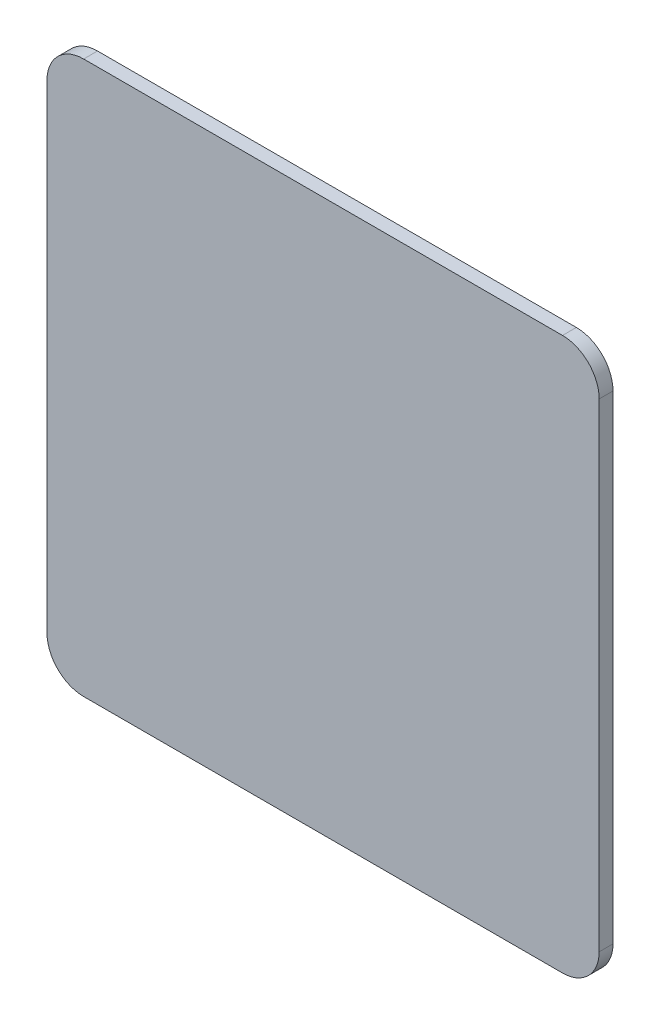
ISO-10303-21;
HEADER;
FILE_DESCRIPTION(('STEP AP214'),'2;1');
FILE_NAME('part.step','',(''),(''),'','','');
FILE_SCHEMA(('AUTOMOTIVE_DESIGN { 1 0 10303 214 1 1 1 1 }'));
ENDSEC;
DATA;
#1=APPLICATION_CONTEXT('core data for automotive mechanical design processes');
#2=APPLICATION_PROTOCOL_DEFINITION('international standard','automotive_design',2000,#1);
#3=PRODUCT_CONTEXT('',#1,'mechanical');
#4=PRODUCT('Part','Part','',(#3));
#5=PRODUCT_RELATED_PRODUCT_CATEGORY('part','',(#4));
#6=PRODUCT_DEFINITION_FORMATION('','',#4);
#7=PRODUCT_DEFINITION_CONTEXT('part definition',#1,'design');
#8=PRODUCT_DEFINITION('design','',#6,#7);
#9=PRODUCT_DEFINITION_SHAPE('','',#8);
#10=(LENGTH_UNIT() NAMED_UNIT(*) SI_UNIT(.MILLI.,.METRE.));
#11=(NAMED_UNIT(*) PLANE_ANGLE_UNIT() SI_UNIT($,.RADIAN.));
#12=(NAMED_UNIT(*) SI_UNIT($,.STERADIAN.) SOLID_ANGLE_UNIT());
#13=UNCERTAINTY_MEASURE_WITH_UNIT(LENGTH_MEASURE(1.E-05),#10,'distance_accuracy_value','');
#14=(GEOMETRIC_REPRESENTATION_CONTEXT(3) GLOBAL_UNCERTAINTY_ASSIGNED_CONTEXT((#13)) GLOBAL_UNIT_ASSIGNED_CONTEXT((#10,
#11,#12)) REPRESENTATION_CONTEXT('',''));
#15=CARTESIAN_POINT('',(0.,0.,0.));
#16=DIRECTION('',(0.,0.,1.));
#17=DIRECTION('',(1.,0.,0.));
#18=AXIS2_PLACEMENT_3D('',#15,#16,#17);
#19=CARTESIAN_POINT('',(14.24999934,-5.000000563835,-2.711602067947));
#20=DIRECTION('',(0.,8.74227761983997E-08,-0.999999999999996));
#21=DIRECTION('',(0.,0.999999999999996,8.74227761983997E-08));
#22=AXIS2_PLACEMENT_3D('',#19,#20,#21);
#23=PLANE('',#22);
#24=CARTESIAN_POINT('',(12.519999264379,-6.730000488214,-2.71160221918896));
#25=DIRECTION('',(0.,8.74227761983997E-08,-0.999999999999996));
#26=DIRECTION('',(0.,0.999999999999996,8.74227761983997E-08));
#27=AXIS2_PLACEMENT_3D('',#24,#25,#26);
#28=CIRCLE('',#27,0.265);
#29=CARTESIAN_POINT('',(12.5199992527957,-6.9950004882143,-2.711602242356));
#30=VERTEX_POINT('',#29);
#31=CARTESIAN_POINT('',(12.254999264379,-6.73000047663074,-2.71160221918898));
#32=VERTEX_POINT('',#31);
#33=EDGE_CURVE('E20',#30,#32,#28,.T.);
#34=ORIENTED_EDGE('',*,*,#33,.F.);
#35=DIRECTION('',(0.999999999999999,-4.37113883669596E-08,0.));
#36=VECTOR('',#35,1.);
#37=CARTESIAN_POINT('',(15.979999252796,-6.995000639456,-2.711602242356));
#38=LINE('',#37,#36);
#39=CARTESIAN_POINT('',(15.9799992527957,-6.995000639456,-2.71160224235602));
#40=VERTEX_POINT('',#39);
#41=EDGE_CURVE('E99',#40,#30,#38,.F.);
#42=ORIENTED_EDGE('',*,*,#41,.F.);
#43=CARTESIAN_POINT('',(15.979999264379,-6.730000639456,-2.711602219189));
#44=DIRECTION('',(0.,8.74227761983997E-08,-0.999999999999996));
#45=DIRECTION('',(0.,0.999999999999996,8.74227761983997E-08));
#46=AXIS2_PLACEMENT_3D('',#43,#44,#45);
#47=CIRCLE('',#46,0.265);
#48=CARTESIAN_POINT('',(16.2449992643794,-6.73000065103941,-2.7116020679475));
#49=VERTEX_POINT('',#48);
#50=EDGE_CURVE('E107',#49,#40,#47,.T.);
#51=ORIENTED_EDGE('',*,*,#50,.F.);
#52=DIRECTION('',(4.371138828674E-08,0.999999999999999,0.));
#53=VECTOR('',#52,1.);
#54=CARTESIAN_POINT('',(16.244999415621,-3.270000651039,-2.711601916706));
#55=LINE('',#54,#53);
#56=CARTESIAN_POINT('',(16.244999415621,-3.270000642297,-2.71160191670602));
#57=VERTEX_POINT('',#56);
#58=EDGE_CURVE('E111',#57,#49,#55,.F.);
#59=ORIENTED_EDGE('',*,*,#58,.F.);
#60=CARTESIAN_POINT('',(15.979999415621,-3.270000639456,-2.71160191670604));
#61=DIRECTION('',(0.,8.74227761983997E-08,-0.999999999999996));
#62=DIRECTION('',(0.,0.999999999999996,8.74227761983997E-08));
#63=AXIS2_PLACEMENT_3D('',#60,#61,#62);
#64=CIRCLE('',#63,0.265);
#65=CARTESIAN_POINT('',(15.9799994214128,-3.0050006394557,-2.711601893539));
#66=VERTEX_POINT('',#65);
#67=EDGE_CURVE('E115',#66,#57,#64,.T.);
#68=ORIENTED_EDGE('',*,*,#67,.F.);
#69=DIRECTION('',(0.999999999999999,-4.37113882867396E-08,0.));
#70=VECTOR('',#69,1.);
#71=CARTESIAN_POINT('',(12.519999427204,-3.005000488214,-2.711601893539));
#72=LINE('',#71,#70);
#73=CARTESIAN_POINT('',(12.5199994272043,-3.005000488214,-2.71160189353898));
#74=VERTEX_POINT('',#73);
#75=EDGE_CURVE('E119',#74,#66,#72,.T.);
#76=ORIENTED_EDGE('',*,*,#75,.F.);
#77=CARTESIAN_POINT('',(12.519999415621,-3.270000488214,-2.711601916706));
#78=DIRECTION('',(0.,8.74227761983997E-08,-0.999999999999996));
#79=DIRECTION('',(0.,0.999999999999996,8.74227761983997E-08));
#80=AXIS2_PLACEMENT_3D('',#77,#78,#79);
#81=CIRCLE('',#80,0.265);
#82=CARTESIAN_POINT('',(12.2549994156206,-3.27000047663037,-2.7116020679475));
#83=VERTEX_POINT('',#82);
#84=EDGE_CURVE('E88',#83,#74,#81,.T.);
#85=ORIENTED_EDGE('',*,*,#84,.F.);
#86=DIRECTION('',(-4.371138828674E-08,-0.999999999999999,0.));
#87=VECTOR('',#86,1.);
#88=CARTESIAN_POINT('',(12.254999264379,-6.730000476631,-2.711602219189));
#89=LINE('',#88,#87);
#90=EDGE_CURVE('E85',#32,#83,#89,.F.);
#91=ORIENTED_EDGE('',*,*,#90,.F.);
#92=EDGE_LOOP('',(#34,#42,#51,#59,#68,#76,#85,#91));
#93=FACE_BOUND('',#92,.T.);
#94=ADVANCED_FACE('F17',(#93),#23,.F.);
#95=CARTESIAN_POINT('',(12.254999264379,-6.730000476631,-2.711602219189));
#96=DIRECTION('',(-0.999999999999999,4.371138828674E-08,0.));
#97=DIRECTION('',(-4.371138828674E-08,-0.999999999999999,0.));
#98=AXIS2_PLACEMENT_3D('',#95,#96,#97);
#99=PLANE('',#98);
#100=DIRECTION('',(0.,0.999999999999996,8.74227761983997E-08));
#101=VECTOR('',#100,1.);
#102=CARTESIAN_POINT('',(12.254999264379,-5.000000555093,-2.811602067947));
#103=LINE('',#102,#101);
#104=CARTESIAN_POINT('',(12.254999264379,-6.73000047368022,-2.8116022191887));
#105=VERTEX_POINT('',#104);
#106=CARTESIAN_POINT('',(12.25499934,-3.27000047367986,-2.81160191670604));
#107=VERTEX_POINT('',#106);
#108=EDGE_CURVE('E94',#105,#107,#103,.T.);
#109=ORIENTED_EDGE('',*,*,#108,.F.);
#110=DIRECTION('',(0.,8.74227761983997E-08,-0.999999999999996));
#111=VECTOR('',#110,1.);
#112=CARTESIAN_POINT('',(12.254999264379,-6.730000476631,-2.711602219189));
#113=LINE('',#112,#111);
#114=EDGE_CURVE('E84',#32,#105,#113,.T.);
#115=ORIENTED_EDGE('',*,*,#114,.F.);
#116=ORIENTED_EDGE('',*,*,#90,.T.);
#117=DIRECTION('',(0.,8.74227761983997E-08,-0.999999999999996));
#118=VECTOR('',#117,1.);
#119=CARTESIAN_POINT('',(12.254999415621,-3.27000047663028,-2.711601916706));
#120=LINE('',#119,#118);
#121=EDGE_CURVE('E120',#107,#83,#120,.F.);
#122=ORIENTED_EDGE('',*,*,#121,.F.);
#123=EDGE_LOOP('',(#109,#115,#116,#122));
#124=FACE_BOUND('',#123,.T.);
#125=ADVANCED_FACE('F92',(#124),#99,.T.);
#126=CARTESIAN_POINT('',(12.519999415621,-3.270000488214,-2.711601916706));
#127=DIRECTION('',(0.,8.74227761983997E-08,-0.999999999999996));
#128=DIRECTION('',(0.,0.999999999999996,8.74227761983997E-08));
#129=AXIS2_PLACEMENT_3D('',#126,#127,#128);
#130=CYLINDRICAL_SURFACE('',#129,0.265);
#131=CARTESIAN_POINT('',(12.519999415621,-3.27000047947172,-2.81160191670604));
#132=DIRECTION('',(0.,8.74227761983997E-08,-0.999999999999996));
#133=DIRECTION('',(0.,0.999999999999996,8.74227761983997E-08));
#134=AXIS2_PLACEMENT_3D('',#131,#132,#133);
#135=CIRCLE('',#134,0.265);
#136=CARTESIAN_POINT('',(12.5199994214125,-3.00500047947193,-2.81160189353878));
#137=VERTEX_POINT('',#136);
#138=EDGE_CURVE('E135',#107,#137,#135,.T.);
#139=ORIENTED_EDGE('',*,*,#138,.F.);
#140=ORIENTED_EDGE('',*,*,#121,.T.);
#141=ORIENTED_EDGE('',*,*,#84,.T.);
#142=DIRECTION('',(0.,-8.74227761983997E-08,0.999999999999996));
#143=VECTOR('',#142,1.);
#144=CARTESIAN_POINT('',(12.519999427204,-3.005000488214,-2.711601893539));
#145=LINE('',#144,#143);
#146=EDGE_CURVE('E116',#137,#74,#145,.T.);
#147=ORIENTED_EDGE('',*,*,#146,.F.);
#148=EDGE_LOOP('',(#139,#140,#141,#147));
#149=FACE_BOUND('',#148,.T.);
#150=ADVANCED_FACE('F143',(#149),#130,.T.);
#151=CARTESIAN_POINT('',(12.519999427204,-3.005000488214,-2.711601893539));
#152=DIRECTION('',(4.37113882867398E-08,0.999999999999995,8.74227761983996E-08));
#153=DIRECTION('',(0.,-8.74227761983997E-08,0.999999999999996));
#154=AXIS2_PLACEMENT_3D('',#151,#152,#153);
#155=PLANE('',#154);
#156=DIRECTION('',(1.,0.,0.));
#157=VECTOR('',#156,1.);
#158=CARTESIAN_POINT('',(14.24999934,-3.005000479472,-2.81160189353856));
#159=LINE('',#158,#157);
#160=CARTESIAN_POINT('',(15.979999415621,-3.00500055509286,-2.81160189353896));
#161=VERTEX_POINT('',#160);
#162=EDGE_CURVE('E134',#137,#161,#159,.T.);
#163=ORIENTED_EDGE('',*,*,#162,.F.);
#164=ORIENTED_EDGE('',*,*,#146,.T.);
#165=ORIENTED_EDGE('',*,*,#75,.T.);
#166=DIRECTION('',(0.,8.74227761983997E-08,-0.999999999999996));
#167=VECTOR('',#166,1.);
#168=CARTESIAN_POINT('',(15.979999415621,-3.005000639456,-2.71160189353896));
#169=LINE('',#168,#167);
#170=EDGE_CURVE('E112',#161,#66,#169,.F.);
#171=ORIENTED_EDGE('',*,*,#170,.F.);
#172=EDGE_LOOP('',(#163,#164,#165,#171));
#173=FACE_BOUND('',#172,.T.);
#174=ADVANCED_FACE('F146',(#173),#155,.T.);
#175=CARTESIAN_POINT('',(15.979999415621,-3.270000639456,-2.711601916706));
#176=DIRECTION('',(0.,8.74227761983997E-08,-0.999999999999996));
#177=DIRECTION('',(0.,0.999999999999996,8.74227761983997E-08));
#178=AXIS2_PLACEMENT_3D('',#175,#176,#177);
#179=CYLINDRICAL_SURFACE('',#178,0.265);
#180=CARTESIAN_POINT('',(15.979999415621,-3.27000063071372,-2.811601916706));
#181=DIRECTION('',(0.,8.74227761983997E-08,-0.999999999999996));
#182=DIRECTION('',(0.,0.999999999999996,8.74227761983997E-08));
#183=AXIS2_PLACEMENT_3D('',#180,#181,#182);
#184=CIRCLE('',#183,0.265);
#185=CARTESIAN_POINT('',(16.244999415621,-3.27000063650536,-2.811601916706));
#186=VERTEX_POINT('',#185);
#187=EDGE_CURVE('E131',#161,#186,#184,.T.);
#188=ORIENTED_EDGE('',*,*,#187,.F.);
#189=ORIENTED_EDGE('',*,*,#170,.T.);
#190=ORIENTED_EDGE('',*,*,#67,.T.);
#191=DIRECTION('',(0.,0.,1.));
#192=VECTOR('',#191,1.);
#193=CARTESIAN_POINT('',(16.244999415621,-3.270000642297,-2.711601916706));
#194=LINE('',#193,#192);
#195=EDGE_CURVE('E108',#186,#57,#194,.T.);
#196=ORIENTED_EDGE('',*,*,#195,.F.);
#197=EDGE_LOOP('',(#188,#189,#190,#196));
#198=FACE_BOUND('',#197,.T.);
#199=ADVANCED_FACE('F163',(#198),#179,.T.);
#200=CARTESIAN_POINT('',(16.244999415621,-3.270000651039,-2.711601916706));
#201=DIRECTION('',(0.999999999999999,-4.371138828674E-08,0.));
#202=DIRECTION('',(4.371138828674E-08,0.999999999999999,0.));
#203=AXIS2_PLACEMENT_3D('',#200,#201,#202);
#204=PLANE('',#203);
#205=DIRECTION('',(0.,0.999999999999996,8.74227761983997E-08));
#206=VECTOR('',#205,1.);
#207=CARTESIAN_POINT('',(16.244999415621,-5.000000555093,-2.811602067947));
#208=LINE('',#207,#206);
#209=CARTESIAN_POINT('',(16.24499934,-6.73000063650536,-2.81160221918896));
#210=VERTEX_POINT('',#209);
#211=EDGE_CURVE('E130',#186,#210,#208,.F.);
#212=ORIENTED_EDGE('',*,*,#211,.F.);
#213=ORIENTED_EDGE('',*,*,#195,.T.);
#214=ORIENTED_EDGE('',*,*,#58,.T.);
#215=DIRECTION('',(0.,8.74227761983997E-08,-0.999999999999996));
#216=VECTOR('',#215,1.);
#217=CARTESIAN_POINT('',(16.244999264379,-6.73000065103928,-2.711602219189));
#218=LINE('',#217,#216);
#219=EDGE_CURVE('E104',#210,#49,#218,.F.);
#220=ORIENTED_EDGE('',*,*,#219,.F.);
#221=EDGE_LOOP('',(#212,#213,#214,#220));
#222=FACE_BOUND('',#221,.T.);
#223=ADVANCED_FACE('F158',(#222),#204,.T.);
#224=CARTESIAN_POINT('',(15.979999264379,-6.730000639456,-2.711602219189));
#225=DIRECTION('',(0.,8.74227761983997E-08,-0.999999999999996));
#226=DIRECTION('',(0.,0.999999999999996,8.74227761983997E-08));
#227=AXIS2_PLACEMENT_3D('',#224,#225,#226);
#228=CYLINDRICAL_SURFACE('',#227,0.265);
#229=CARTESIAN_POINT('',(15.979999264379,-6.73000063071372,-2.81160221918896));
#230=DIRECTION('',(0.,8.74227761983997E-08,-0.999999999999996));
#231=DIRECTION('',(0.,0.999999999999996,8.74227761983997E-08));
#232=AXIS2_PLACEMENT_3D('',#229,#230,#231);
#233=CIRCLE('',#232,0.265);
#234=CARTESIAN_POINT('',(15.9799992585875,-6.99500063071336,-2.811602242356));
#235=VERTEX_POINT('',#234);
#236=EDGE_CURVE('E127',#210,#235,#233,.T.);
#237=ORIENTED_EDGE('',*,*,#236,.F.);
#238=ORIENTED_EDGE('',*,*,#219,.T.);
#239=ORIENTED_EDGE('',*,*,#50,.T.);
#240=DIRECTION('',(0.,8.74227761983997E-08,-0.999999999999996));
#241=VECTOR('',#240,1.);
#242=CARTESIAN_POINT('',(15.979999252796,-6.995000639456,-2.711602242356));
#243=LINE('',#242,#241);
#244=EDGE_CURVE('E95',#235,#40,#243,.F.);
#245=ORIENTED_EDGE('',*,*,#244,.F.);
#246=EDGE_LOOP('',(#237,#238,#239,#245));
#247=FACE_BOUND('',#246,.T.);
#248=ADVANCED_FACE('F160',(#247),#228,.T.);
#249=CARTESIAN_POINT('',(15.979999252796,-6.995000639456,-2.711602242356));
#250=DIRECTION('',(-4.37113883669598E-08,-0.999999999999995,-8.74227761983996E-08));
#251=DIRECTION('',(0.,8.74227761983997E-08,-0.999999999999996));
#252=AXIS2_PLACEMENT_3D('',#249,#250,#251);
#253=PLANE('',#252);
#254=DIRECTION('',(1.,0.,0.));
#255=VECTOR('',#254,1.);
#256=CARTESIAN_POINT('',(14.24999934,-6.995000630713,-2.81160224235545));
#257=LINE('',#256,#255);
#258=CARTESIAN_POINT('',(12.5199992585875,-6.99500055509236,-2.81160224235604));
#259=VERTEX_POINT('',#258);
#260=EDGE_CURVE('E26',#235,#259,#257,.F.);
#261=ORIENTED_EDGE('',*,*,#260,.F.);
#262=ORIENTED_EDGE('',*,*,#244,.T.);
#263=ORIENTED_EDGE('',*,*,#41,.T.);
#264=DIRECTION('',(0.,8.74227761983997E-08,-0.999999999999996));
#265=VECTOR('',#264,1.);
#266=CARTESIAN_POINT('',(12.519999252796,-6.995000488214,-2.71160224235604));
#267=LINE('',#266,#265);
#268=EDGE_CURVE('E35',#259,#30,#267,.F.);
#269=ORIENTED_EDGE('',*,*,#268,.F.);
#270=EDGE_LOOP('',(#261,#262,#263,#269));
#271=FACE_BOUND('',#270,.T.);
#272=ADVANCED_FACE('F161',(#271),#253,.T.);
#273=CARTESIAN_POINT('',(12.519999264379,-6.730000488214,-2.711602219189));
#274=DIRECTION('',(0.,8.74227761983997E-08,-0.999999999999996));
#275=DIRECTION('',(0.,0.999999999999996,8.74227761983997E-08));
#276=AXIS2_PLACEMENT_3D('',#273,#274,#275);
#277=CYLINDRICAL_SURFACE('',#276,0.265);
#278=CARTESIAN_POINT('',(12.519999264379,-6.73000047947172,-2.811602219189));
#279=DIRECTION('',(0.,8.74227761983997E-08,-0.999999999999996));
#280=DIRECTION('',(0.,0.999999999999996,8.74227761983997E-08));
#281=AXIS2_PLACEMENT_3D('',#278,#279,#280);
#282=CIRCLE('',#281,0.265);
#283=EDGE_CURVE('E11',#259,#105,#282,.T.);
#284=ORIENTED_EDGE('',*,*,#283,.F.);
#285=ORIENTED_EDGE('',*,*,#268,.T.);
#286=ORIENTED_EDGE('',*,*,#33,.T.);
#287=ORIENTED_EDGE('',*,*,#114,.T.);
#288=EDGE_LOOP('',(#284,#285,#286,#287));
#289=FACE_BOUND('',#288,.T.);
#290=ADVANCED_FACE('F82',(#289),#277,.T.);
#291=CARTESIAN_POINT('',(14.24999934,-5.000000555093,-2.811602067947));
#292=DIRECTION('',(0.,8.74227761983997E-08,-0.999999999999996));
#293=DIRECTION('',(0.,0.999999999999996,8.74227761983997E-08));
#294=AXIS2_PLACEMENT_3D('',#291,#292,#293);
#295=PLANE('',#294);
#296=ORIENTED_EDGE('',*,*,#260,.T.);
#297=ORIENTED_EDGE('',*,*,#283,.T.);
#298=ORIENTED_EDGE('',*,*,#108,.T.);
#299=ORIENTED_EDGE('',*,*,#138,.T.);
#300=ORIENTED_EDGE('',*,*,#162,.T.);
#301=ORIENTED_EDGE('',*,*,#187,.T.);
#302=ORIENTED_EDGE('',*,*,#211,.T.);
#303=ORIENTED_EDGE('',*,*,#236,.T.);
#304=EDGE_LOOP('',(#296,#297,#298,#299,#300,#301,#302,#303));
#305=FACE_BOUND('',#304,.T.);
#306=ADVANCED_FACE('F151',(#305),#295,.T.);
#307=CLOSED_SHELL('',(#94,#125,#150,#174,#199,#223,#248,#272,#290,#306));
#308=MANIFOLD_SOLID_BREP('B1',#307);
#309=ADVANCED_BREP_SHAPE_REPRESENTATION('',(#18,#308),#14);
#310=SHAPE_DEFINITION_REPRESENTATION(#9,#309);
ENDSEC;
END-ISO-10303-21;
